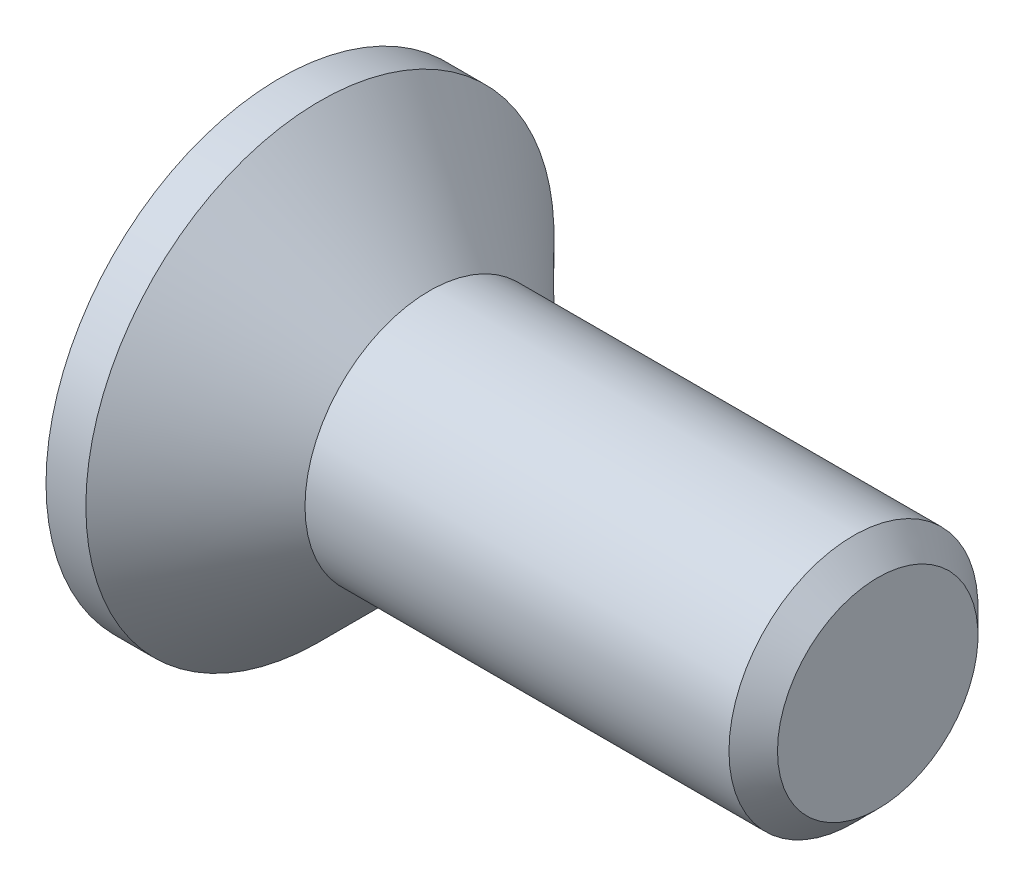
ISO-10303-21;
HEADER;
FILE_DESCRIPTION(('STEP AP214'),'2;1');
FILE_NAME('part.step','',(''),(''),'','','');
FILE_SCHEMA(('AUTOMOTIVE_DESIGN { 1 0 10303 214 1 1 1 1 }'));
ENDSEC;
DATA;
#1=APPLICATION_CONTEXT('core data for automotive mechanical design processes');
#2=APPLICATION_PROTOCOL_DEFINITION('international standard','automotive_design',2000,#1);
#3=PRODUCT_CONTEXT('',#1,'mechanical');
#4=PRODUCT('Part','Part','',(#3));
#5=PRODUCT_RELATED_PRODUCT_CATEGORY('part','',(#4));
#6=PRODUCT_DEFINITION_FORMATION('','',#4);
#7=PRODUCT_DEFINITION_CONTEXT('part definition',#1,'design');
#8=PRODUCT_DEFINITION('design','',#6,#7);
#9=PRODUCT_DEFINITION_SHAPE('','',#8);
#10=(LENGTH_UNIT() NAMED_UNIT(*) SI_UNIT(.MILLI.,.METRE.));
#11=(NAMED_UNIT(*) PLANE_ANGLE_UNIT() SI_UNIT($,.RADIAN.));
#12=(NAMED_UNIT(*) SI_UNIT($,.STERADIAN.) SOLID_ANGLE_UNIT());
#13=UNCERTAINTY_MEASURE_WITH_UNIT(LENGTH_MEASURE(1.E-05),#10,'distance_accuracy_value','');
#14=(GEOMETRIC_REPRESENTATION_CONTEXT(3) GLOBAL_UNCERTAINTY_ASSIGNED_CONTEXT((#13)) GLOBAL_UNIT_ASSIGNED_CONTEXT((#10,
#11,#12)) REPRESENTATION_CONTEXT('',''));
#15=CARTESIAN_POINT('',(0.,0.,0.));
#16=DIRECTION('',(0.,0.,1.));
#17=DIRECTION('',(1.,0.,0.));
#18=AXIS2_PLACEMENT_3D('',#15,#16,#17);
#19=CARTESIAN_POINT('',(0.,0.,0.));
#20=DIRECTION('',(-1.,0.,0.));
#21=DIRECTION('',(0.,0.,1.));
#22=AXIS2_PLACEMENT_3D('',#19,#20,#21);
#23=CYLINDRICAL_SURFACE('',#22,2.35);
#24=CARTESIAN_POINT('',(0.4,0.,0.));
#25=DIRECTION('',(-1.,0.,0.));
#26=DIRECTION('',(0.,0.,1.));
#27=AXIS2_PLACEMENT_3D('',#24,#25,#26);
#28=CIRCLE('',#27,2.35);
#29=CARTESIAN_POINT('',(0.4,0.,2.35));
#30=VERTEX_POINT('',#29);
#31=EDGE_CURVE('E219',#30,#30,#28,.T.);
#32=ORIENTED_EDGE('',*,*,#31,.T.);
#33=EDGE_LOOP('',(#32));
#34=FACE_BOUND('',#33,.T.);
#35=CARTESIAN_POINT('',(0.,0.,0.));
#36=DIRECTION('',(-1.,0.,0.));
#37=DIRECTION('',(0.,0.,1.));
#38=AXIS2_PLACEMENT_3D('',#35,#36,#37);
#39=CIRCLE('',#38,2.35);
#40=CARTESIAN_POINT('',(0.,0.,2.35));
#41=VERTEX_POINT('',#40);
#42=EDGE_CURVE('E11',#41,#41,#39,.T.);
#43=ORIENTED_EDGE('',*,*,#42,.F.);
#44=EDGE_LOOP('',(#43));
#45=FACE_BOUND('',#44,.T.);
#46=ADVANCED_FACE('F16',(#34,#45),#23,.T.);
#47=CARTESIAN_POINT('',(0.,0.,0.));
#48=DIRECTION('',(-1.,0.,0.));
#49=DIRECTION('',(0.,0.,1.));
#50=AXIS2_PLACEMENT_3D('',#47,#48,#49);
#51=PLANE('',#50);
#52=DIRECTION('',(0.,1.,0.));
#53=VECTOR('',#52,1.);
#54=CARTESIAN_POINT('',(0.,-0.29,1.45));
#55=LINE('',#54,#53);
#56=CARTESIAN_POINT('',(0.,-0.29,1.45));
#57=VERTEX_POINT('',#56);
#58=CARTESIAN_POINT('',(0.,0.29,1.45));
#59=VERTEX_POINT('',#58);
#60=EDGE_CURVE('E31',#57,#59,#55,.T.);
#61=ORIENTED_EDGE('',*,*,#60,.F.);
#62=DIRECTION('',(0.,0.,-1.));
#63=VECTOR('',#62,1.);
#64=CARTESIAN_POINT('',(0.,-0.29,1.45));
#65=LINE('',#64,#63);
#66=CARTESIAN_POINT('',(0.,-0.29,0.58));
#67=VERTEX_POINT('',#66);
#68=EDGE_CURVE('E206',#57,#67,#65,.T.);
#69=ORIENTED_EDGE('',*,*,#68,.T.);
#70=CARTESIAN_POINT('',(0.,-0.58,0.58));
#71=DIRECTION('',(1.,0.,0.));
#72=DIRECTION('',(0.,0.,-1.));
#73=AXIS2_PLACEMENT_3D('',#70,#71,#72);
#74=CIRCLE('',#73,0.29);
#75=CARTESIAN_POINT('',(0.,-0.58,0.29));
#76=VERTEX_POINT('',#75);
#77=EDGE_CURVE('E202',#76,#67,#74,.T.);
#78=ORIENTED_EDGE('',*,*,#77,.F.);
#79=DIRECTION('',(0.,1.,0.));
#80=VECTOR('',#79,1.);
#81=CARTESIAN_POINT('',(0.,-1.45,0.29));
#82=LINE('',#81,#80);
#83=CARTESIAN_POINT('',(0.,-1.45,0.29));
#84=VERTEX_POINT('',#83);
#85=EDGE_CURVE('E198',#84,#76,#82,.T.);
#86=ORIENTED_EDGE('',*,*,#85,.F.);
#87=DIRECTION('',(0.,0.,-1.));
#88=VECTOR('',#87,1.);
#89=CARTESIAN_POINT('',(0.,-1.45,0.29));
#90=LINE('',#89,#88);
#91=CARTESIAN_POINT('',(0.,-1.45,-0.29));
#92=VERTEX_POINT('',#91);
#93=EDGE_CURVE('E194',#84,#92,#90,.T.);
#94=ORIENTED_EDGE('',*,*,#93,.T.);
#95=DIRECTION('',(0.,1.,0.));
#96=VECTOR('',#95,1.);
#97=CARTESIAN_POINT('',(0.,-1.45,-0.29));
#98=LINE('',#97,#96);
#99=CARTESIAN_POINT('',(0.,-0.58,-0.29));
#100=VERTEX_POINT('',#99);
#101=EDGE_CURVE('E190',#92,#100,#98,.T.);
#102=ORIENTED_EDGE('',*,*,#101,.T.);
#103=CARTESIAN_POINT('',(0.,-0.58,-0.58));
#104=DIRECTION('',(1.,0.,0.));
#105=DIRECTION('',(0.,0.,-1.));
#106=AXIS2_PLACEMENT_3D('',#103,#104,#105);
#107=CIRCLE('',#106,0.29);
#108=CARTESIAN_POINT('',(0.,-0.29,-0.58));
#109=VERTEX_POINT('',#108);
#110=EDGE_CURVE('E186',#109,#100,#107,.T.);
#111=ORIENTED_EDGE('',*,*,#110,.F.);
#112=DIRECTION('',(0.,0.,-1.));
#113=VECTOR('',#112,1.);
#114=CARTESIAN_POINT('',(0.,-0.29,-0.58));
#115=LINE('',#114,#113);
#116=CARTESIAN_POINT('',(0.,-0.29,-1.45));
#117=VERTEX_POINT('',#116);
#118=EDGE_CURVE('E182',#109,#117,#115,.T.);
#119=ORIENTED_EDGE('',*,*,#118,.T.);
#120=DIRECTION('',(0.,1.,0.));
#121=VECTOR('',#120,1.);
#122=CARTESIAN_POINT('',(0.,-0.29,-1.45));
#123=LINE('',#122,#121);
#124=CARTESIAN_POINT('',(0.,0.29,-1.45));
#125=VERTEX_POINT('',#124);
#126=EDGE_CURVE('E178',#117,#125,#123,.T.);
#127=ORIENTED_EDGE('',*,*,#126,.T.);
#128=DIRECTION('',(0.,0.,-1.));
#129=VECTOR('',#128,1.);
#130=CARTESIAN_POINT('',(0.,0.29,-0.58));
#131=LINE('',#130,#129);
#132=CARTESIAN_POINT('',(0.,0.29,-0.58));
#133=VERTEX_POINT('',#132);
#134=EDGE_CURVE('E174',#133,#125,#131,.T.);
#135=ORIENTED_EDGE('',*,*,#134,.F.);
#136=CARTESIAN_POINT('',(0.,0.58,-0.58));
#137=DIRECTION('',(1.,0.,0.));
#138=DIRECTION('',(0.,0.,-1.));
#139=AXIS2_PLACEMENT_3D('',#136,#137,#138);
#140=CIRCLE('',#139,0.29);
#141=CARTESIAN_POINT('',(0.,0.58,-0.29));
#142=VERTEX_POINT('',#141);
#143=EDGE_CURVE('E170',#142,#133,#140,.T.);
#144=ORIENTED_EDGE('',*,*,#143,.F.);
#145=DIRECTION('',(0.,1.,0.));
#146=VECTOR('',#145,1.);
#147=CARTESIAN_POINT('',(0.,0.58,-0.29));
#148=LINE('',#147,#146);
#149=CARTESIAN_POINT('',(0.,1.45,-0.29));
#150=VERTEX_POINT('',#149);
#151=EDGE_CURVE('E166',#142,#150,#148,.T.);
#152=ORIENTED_EDGE('',*,*,#151,.T.);
#153=DIRECTION('',(0.,0.,-1.));
#154=VECTOR('',#153,1.);
#155=CARTESIAN_POINT('',(0.,1.45,0.29));
#156=LINE('',#155,#154);
#157=CARTESIAN_POINT('',(0.,1.45,0.29));
#158=VERTEX_POINT('',#157);
#159=EDGE_CURVE('E160',#158,#150,#156,.T.);
#160=ORIENTED_EDGE('',*,*,#159,.F.);
#161=DIRECTION('',(0.,1.,0.));
#162=VECTOR('',#161,1.);
#163=CARTESIAN_POINT('',(0.,0.58,0.29));
#164=LINE('',#163,#162);
#165=CARTESIAN_POINT('',(0.,0.58,0.29));
#166=VERTEX_POINT('',#165);
#167=EDGE_CURVE('E154',#166,#158,#164,.T.);
#168=ORIENTED_EDGE('',*,*,#167,.F.);
#169=CARTESIAN_POINT('',(0.,0.58,0.58));
#170=DIRECTION('',(1.,0.,0.));
#171=DIRECTION('',(0.,0.,-1.));
#172=AXIS2_PLACEMENT_3D('',#169,#170,#171);
#173=CIRCLE('',#172,0.29);
#174=CARTESIAN_POINT('',(0.,0.29,0.58));
#175=VERTEX_POINT('',#174);
#176=EDGE_CURVE('E133',#175,#166,#173,.T.);
#177=ORIENTED_EDGE('',*,*,#176,.F.);
#178=DIRECTION('',(0.,0.,-1.));
#179=VECTOR('',#178,1.);
#180=CARTESIAN_POINT('',(0.,0.29,1.45));
#181=LINE('',#180,#179);
#182=EDGE_CURVE('E145',#59,#175,#181,.T.);
#183=ORIENTED_EDGE('',*,*,#182,.F.);
#184=EDGE_LOOP('',(#61,#69,#78,#86,#94,#102,#111,#119,#127,#135,#144,#152,#160,#168,#177,#183));
#185=FACE_BOUND('',#184,.T.);
#186=ORIENTED_EDGE('',*,*,#42,.T.);
#187=EDGE_LOOP('',(#186));
#188=FACE_BOUND('',#187,.T.);
#189=ADVANCED_FACE('F150',(#185,#188),#51,.T.);
#190=CARTESIAN_POINT('',(6.,0.,0.));
#191=DIRECTION('',(-1.,0.,0.));
#192=DIRECTION('',(0.,0.,1.));
#193=AXIS2_PLACEMENT_3D('',#190,#191,#192);
#194=PLANE('',#193);
#195=CARTESIAN_POINT('',(6.,0.,0.));
#196=DIRECTION('',(-1.,0.,0.));
#197=DIRECTION('',(0.,0.,1.));
#198=AXIS2_PLACEMENT_3D('',#195,#196,#197);
#199=CIRCLE('',#198,1.0064375);
#200=CARTESIAN_POINT('',(6.,0.,1.0064375));
#201=VERTEX_POINT('',#200);
#202=EDGE_CURVE('E24',#201,#201,#199,.T.);
#203=ORIENTED_EDGE('',*,*,#202,.F.);
#204=EDGE_LOOP('',(#203));
#205=FACE_BOUND('',#204,.T.);
#206=ADVANCED_FACE('F330',(#205),#194,.F.);
#207=CARTESIAN_POINT('',(5.7564375,0.,0.));
#208=DIRECTION('',(-1.,0.,0.));
#209=DIRECTION('',(0.,0.,1.));
#210=AXIS2_PLACEMENT_3D('',#207,#208,#209);
#211=CONICAL_SURFACE('',#210,1.25,0.785398163397446);
#212=ORIENTED_EDGE('',*,*,#202,.T.);
#213=EDGE_LOOP('',(#212));
#214=FACE_BOUND('',#213,.T.);
#215=CARTESIAN_POINT('',(5.7564375,0.,0.));
#216=DIRECTION('',(-1.,0.,0.));
#217=DIRECTION('',(0.,0.,1.));
#218=AXIS2_PLACEMENT_3D('',#215,#216,#217);
#219=CIRCLE('',#218,1.25);
#220=CARTESIAN_POINT('',(5.7564375,0.,1.25));
#221=VERTEX_POINT('',#220);
#222=EDGE_CURVE('E317',#221,#221,#219,.T.);
#223=ORIENTED_EDGE('',*,*,#222,.F.);
#224=EDGE_LOOP('',(#223));
#225=FACE_BOUND('',#224,.T.);
#226=ADVANCED_FACE('F327',(#214,#225),#211,.T.);
#227=CARTESIAN_POINT('',(0.,0.,0.));
#228=DIRECTION('',(-1.,0.,0.));
#229=DIRECTION('',(0.,0.,1.));
#230=AXIS2_PLACEMENT_3D('',#227,#228,#229);
#231=CYLINDRICAL_SURFACE('',#230,1.25);
#232=ORIENTED_EDGE('',*,*,#222,.T.);
#233=EDGE_LOOP('',(#232));
#234=FACE_BOUND('',#233,.T.);
#235=CARTESIAN_POINT('',(1.5,0.,0.));
#236=DIRECTION('',(-1.,0.,0.));
#237=DIRECTION('',(0.,0.,1.));
#238=AXIS2_PLACEMENT_3D('',#235,#236,#237);
#239=CIRCLE('',#238,1.25);
#240=CARTESIAN_POINT('',(1.5,0.,1.25));
#241=VERTEX_POINT('',#240);
#242=EDGE_CURVE('E313',#241,#241,#239,.T.);
#243=ORIENTED_EDGE('',*,*,#242,.F.);
#244=EDGE_LOOP('',(#243));
#245=FACE_BOUND('',#244,.T.);
#246=ADVANCED_FACE('F338',(#234,#245),#231,.T.);
#247=CARTESIAN_POINT('',(1.5,0.,0.));
#248=DIRECTION('',(-1.,0.,0.));
#249=DIRECTION('',(0.,0.,1.));
#250=AXIS2_PLACEMENT_3D('',#247,#248,#249);
#251=CONICAL_SURFACE('',#250,1.25,0.785398163397448);
#252=ORIENTED_EDGE('',*,*,#31,.F.);
#253=EDGE_LOOP('',(#252));
#254=FACE_BOUND('',#253,.T.);
#255=ORIENTED_EDGE('',*,*,#242,.T.);
#256=EDGE_LOOP('',(#255));
#257=FACE_BOUND('',#256,.T.);
#258=ADVANCED_FACE('F348',(#254,#257),#251,.T.);
#259=CARTESIAN_POINT('',(0.,-0.29,1.45));
#260=DIRECTION('',(0.149438132473599,0.,0.988771077936042));
#261=DIRECTION('',(0.988771077936042,0.,-0.149438132473599));
#262=AXIS2_PLACEMENT_3D('',#259,#260,#261);
#263=PLANE('',#262);
#264=ORIENTED_EDGE('',*,*,#60,.T.);
#265=DIRECTION('',(-0.977912120929502,0.14779696163853,0.14779696163853));
#266=VECTOR('',#265,1.);
#267=CARTESIAN_POINT('',(0.0838288153292653,0.277330513715643,1.43733051371564));
#268=LINE('',#267,#266);
#269=CARTESIAN_POINT('',(1.4,0.0784106947183877,1.23841069471839));
#270=VERTEX_POINT('',#269);
#271=EDGE_CURVE('E142',#270,#59,#268,.T.);
#272=ORIENTED_EDGE('',*,*,#271,.F.);
#273=DIRECTION('',(0.,1.,0.));
#274=VECTOR('',#273,1.);
#275=CARTESIAN_POINT('',(1.4,-0.29,1.23841069471839));
#276=LINE('',#275,#274);
#277=CARTESIAN_POINT('',(1.4,-0.0784106947183861,1.23841069471839));
#278=VERTEX_POINT('',#277);
#279=EDGE_CURVE('E210',#278,#270,#276,.T.);
#280=ORIENTED_EDGE('',*,*,#279,.F.);
#281=DIRECTION('',(0.977912120929502,0.14779696163853,-0.14779696163853));
#282=VECTOR('',#281,1.);
#283=CARTESIAN_POINT('',(0.,-0.29,1.45));
#284=LINE('',#283,#282);
#285=EDGE_CURVE('E38',#278,#57,#284,.F.);
#286=ORIENTED_EDGE('',*,*,#285,.T.);
#287=EDGE_LOOP('',(#264,#272,#280,#286));
#288=FACE_BOUND('',#287,.T.);
#289=ADVANCED_FACE('F351',(#288),#263,.F.);
#290=CARTESIAN_POINT('',(0.,-0.29,1.45));
#291=DIRECTION('',(0.149438132473599,-0.988771077936042,0.));
#292=DIRECTION('',(-0.988771077936042,-0.149438132473599,0.));
#293=AXIS2_PLACEMENT_3D('',#290,#291,#292);
#294=PLANE('',#293);
#295=ORIENTED_EDGE('',*,*,#68,.F.);
#296=ORIENTED_EDGE('',*,*,#285,.F.);
#297=DIRECTION('',(0.,0.,1.));
#298=VECTOR('',#297,1.);
#299=CARTESIAN_POINT('',(1.4,-0.0784106947183862,1.45));
#300=LINE('',#299,#298);
#301=CARTESIAN_POINT('',(1.4,-0.0784106947183868,0.58));
#302=VERTEX_POINT('',#301);
#303=EDGE_CURVE('E256',#278,#302,#300,.F.);
#304=ORIENTED_EDGE('',*,*,#303,.T.);
#305=DIRECTION('',(-0.988771077936042,-0.149438132473599,0.));
#306=VECTOR('',#305,1.);
#307=CARTESIAN_POINT('',(0.,-0.29,0.58));
#308=LINE('',#307,#306);
#309=EDGE_CURVE('E213',#302,#67,#308,.T.);
#310=ORIENTED_EDGE('',*,*,#309,.T.);
#311=EDGE_LOOP('',(#295,#296,#304,#310));
#312=FACE_BOUND('',#311,.T.);
#313=ADVANCED_FACE('F363',(#312),#294,.F.);
#314=CARTESIAN_POINT('',(0.,-0.58,0.58));
#315=DIRECTION('',(1.,0.,0.));
#316=DIRECTION('',(0.,0.,-1.));
#317=AXIS2_PLACEMENT_3D('',#314,#315,#316);
#318=CONICAL_SURFACE('',#317,0.29,0.15);
#319=ORIENTED_EDGE('',*,*,#77,.T.);
#320=ORIENTED_EDGE('',*,*,#309,.F.);
#321=CARTESIAN_POINT('',(1.4,-0.58,0.58));
#322=DIRECTION('',(1.,0.,0.));
#323=DIRECTION('',(0.,0.,-1.));
#324=AXIS2_PLACEMENT_3D('',#321,#322,#323);
#325=CIRCLE('',#324,0.501589305281613);
#326=CARTESIAN_POINT('',(1.4,-0.58,0.0784106947183868));
#327=VERTEX_POINT('',#326);
#328=EDGE_CURVE('E259',#327,#302,#325,.T.);
#329=ORIENTED_EDGE('',*,*,#328,.F.);
#330=DIRECTION('',(-0.988771077936042,0.,0.149438132473599));
#331=VECTOR('',#330,1.);
#332=CARTESIAN_POINT('',(0.,-0.58,0.29));
#333=LINE('',#332,#331);
#334=EDGE_CURVE('E216',#327,#76,#333,.T.);
#335=ORIENTED_EDGE('',*,*,#334,.T.);
#336=EDGE_LOOP('',(#319,#320,#329,#335));
#337=FACE_BOUND('',#336,.T.);
#338=ADVANCED_FACE('F412',(#337),#318,.T.);
#339=CARTESIAN_POINT('',(0.,-1.45,0.29));
#340=DIRECTION('',(0.149438132473599,0.,0.988771077936042));
#341=DIRECTION('',(0.988771077936042,0.,-0.149438132473599));
#342=AXIS2_PLACEMENT_3D('',#339,#340,#341);
#343=PLANE('',#342);
#344=ORIENTED_EDGE('',*,*,#85,.T.);
#345=ORIENTED_EDGE('',*,*,#334,.F.);
#346=DIRECTION('',(0.,1.,0.));
#347=VECTOR('',#346,1.);
#348=CARTESIAN_POINT('',(1.4,-1.45,0.0784106947183868));
#349=LINE('',#348,#347);
#350=CARTESIAN_POINT('',(1.4,-1.23841069471839,0.0784106947183868));
#351=VERTEX_POINT('',#350);
#352=EDGE_CURVE('E263',#351,#327,#349,.T.);
#353=ORIENTED_EDGE('',*,*,#352,.F.);
#354=DIRECTION('',(0.977912120929502,0.14779696163853,-0.14779696163853));
#355=VECTOR('',#354,1.);
#356=CARTESIAN_POINT('',(0.,-1.45,0.29));
#357=LINE('',#356,#355);
#358=EDGE_CURVE('E222',#351,#84,#357,.F.);
#359=ORIENTED_EDGE('',*,*,#358,.T.);
#360=EDGE_LOOP('',(#344,#345,#353,#359));
#361=FACE_BOUND('',#360,.T.);
#362=ADVANCED_FACE('F408',(#361),#343,.F.);
#363=CARTESIAN_POINT('',(0.,-1.45,0.29));
#364=DIRECTION('',(0.149438132473599,-0.988771077936042,0.));
#365=DIRECTION('',(-0.988771077936042,-0.149438132473599,0.));
#366=AXIS2_PLACEMENT_3D('',#363,#364,#365);
#367=PLANE('',#366);
#368=ORIENTED_EDGE('',*,*,#93,.F.);
#369=ORIENTED_EDGE('',*,*,#358,.F.);
#370=DIRECTION('',(0.,0.,1.));
#371=VECTOR('',#370,1.);
#372=CARTESIAN_POINT('',(1.4,-1.23841069471839,0.29));
#373=LINE('',#372,#371);
#374=CARTESIAN_POINT('',(1.4,-1.23841069471839,-0.078410694718387));
#375=VERTEX_POINT('',#374);
#376=EDGE_CURVE('E267',#351,#375,#373,.F.);
#377=ORIENTED_EDGE('',*,*,#376,.T.);
#378=DIRECTION('',(-0.977912120929502,-0.14779696163853,-0.14779696163853));
#379=VECTOR('',#378,1.);
#380=CARTESIAN_POINT('',(0.,-1.45,-0.29));
#381=LINE('',#380,#379);
#382=EDGE_CURVE('E225',#375,#92,#381,.T.);
#383=ORIENTED_EDGE('',*,*,#382,.T.);
#384=EDGE_LOOP('',(#368,#369,#377,#383));
#385=FACE_BOUND('',#384,.T.);
#386=ADVANCED_FACE('F404',(#385),#367,.F.);
#387=CARTESIAN_POINT('',(0.,-1.45,-0.29));
#388=DIRECTION('',(0.149438132473599,0.,-0.988771077936042));
#389=DIRECTION('',(-0.988771077936042,0.,-0.149438132473599));
#390=AXIS2_PLACEMENT_3D('',#387,#388,#389);
#391=PLANE('',#390);
#392=ORIENTED_EDGE('',*,*,#101,.F.);
#393=ORIENTED_EDGE('',*,*,#382,.F.);
#394=DIRECTION('',(0.,-1.,0.));
#395=VECTOR('',#394,1.);
#396=CARTESIAN_POINT('',(1.4,-1.45,-0.0784106947183871));
#397=LINE('',#396,#395);
#398=CARTESIAN_POINT('',(1.4,-0.58,-0.0784106947183872));
#399=VERTEX_POINT('',#398);
#400=EDGE_CURVE('E270',#375,#399,#397,.F.);
#401=ORIENTED_EDGE('',*,*,#400,.T.);
#402=DIRECTION('',(-0.988771077936042,0.,-0.149438132473599));
#403=VECTOR('',#402,1.);
#404=CARTESIAN_POINT('',(0.,-0.58,-0.29));
#405=LINE('',#404,#403);
#406=EDGE_CURVE('E228',#399,#100,#405,.T.);
#407=ORIENTED_EDGE('',*,*,#406,.T.);
#408=EDGE_LOOP('',(#392,#393,#401,#407));
#409=FACE_BOUND('',#408,.T.);
#410=ADVANCED_FACE('F400',(#409),#391,.F.);
#411=CARTESIAN_POINT('',(0.,-0.58,-0.58));
#412=DIRECTION('',(1.,0.,0.));
#413=DIRECTION('',(0.,0.,-1.));
#414=AXIS2_PLACEMENT_3D('',#411,#412,#413);
#415=CONICAL_SURFACE('',#414,0.29,0.15);
#416=ORIENTED_EDGE('',*,*,#110,.T.);
#417=ORIENTED_EDGE('',*,*,#406,.F.);
#418=CARTESIAN_POINT('',(1.4,-0.58,-0.58));
#419=DIRECTION('',(1.,0.,0.));
#420=DIRECTION('',(0.,0.,-1.));
#421=AXIS2_PLACEMENT_3D('',#418,#419,#420);
#422=CIRCLE('',#421,0.501589305281613);
#423=CARTESIAN_POINT('',(1.4,-0.0784106947183868,-0.58));
#424=VERTEX_POINT('',#423);
#425=EDGE_CURVE('E273',#424,#399,#422,.T.);
#426=ORIENTED_EDGE('',*,*,#425,.F.);
#427=DIRECTION('',(-0.988771077936042,-0.149438132473599,0.));
#428=VECTOR('',#427,1.);
#429=CARTESIAN_POINT('',(0.,-0.29,-0.58));
#430=LINE('',#429,#428);
#431=EDGE_CURVE('E231',#424,#109,#430,.T.);
#432=ORIENTED_EDGE('',*,*,#431,.T.);
#433=EDGE_LOOP('',(#416,#417,#426,#432));
#434=FACE_BOUND('',#433,.T.);
#435=ADVANCED_FACE('F396',(#434),#415,.T.);
#436=CARTESIAN_POINT('',(0.,-0.29,-0.58));
#437=DIRECTION('',(0.149438132473599,-0.988771077936042,0.));
#438=DIRECTION('',(-0.988771077936042,-0.149438132473599,0.));
#439=AXIS2_PLACEMENT_3D('',#436,#437,#438);
#440=PLANE('',#439);
#441=ORIENTED_EDGE('',*,*,#118,.F.);
#442=ORIENTED_EDGE('',*,*,#431,.F.);
#443=DIRECTION('',(0.,0.,1.));
#444=VECTOR('',#443,1.);
#445=CARTESIAN_POINT('',(1.4,-0.0784106947183867,-0.58));
#446=LINE('',#445,#444);
#447=CARTESIAN_POINT('',(1.4,-0.0784106947183867,-1.23841069471839));
#448=VERTEX_POINT('',#447);
#449=EDGE_CURVE('E277',#424,#448,#446,.F.);
#450=ORIENTED_EDGE('',*,*,#449,.T.);
#451=DIRECTION('',(-0.977912120929502,-0.14779696163853,-0.14779696163853));
#452=VECTOR('',#451,1.);
#453=CARTESIAN_POINT('',(0.,-0.29,-1.45));
#454=LINE('',#453,#452);
#455=EDGE_CURVE('E234',#448,#117,#454,.T.);
#456=ORIENTED_EDGE('',*,*,#455,.T.);
#457=EDGE_LOOP('',(#441,#442,#450,#456));
#458=FACE_BOUND('',#457,.T.);
#459=ADVANCED_FACE('F392',(#458),#440,.F.);
#460=CARTESIAN_POINT('',(0.,-0.29,-1.45));
#461=DIRECTION('',(0.149438132473599,0.,-0.988771077936042));
#462=DIRECTION('',(-0.988771077936042,0.,-0.149438132473599));
#463=AXIS2_PLACEMENT_3D('',#460,#461,#462);
#464=PLANE('',#463);
#465=ORIENTED_EDGE('',*,*,#126,.F.);
#466=ORIENTED_EDGE('',*,*,#455,.F.);
#467=DIRECTION('',(0.,-1.,0.));
#468=VECTOR('',#467,1.);
#469=CARTESIAN_POINT('',(1.4,-0.29,-1.23841069471839));
#470=LINE('',#469,#468);
#471=CARTESIAN_POINT('',(1.4,0.0784106947183871,-1.23841069471839));
#472=VERTEX_POINT('',#471);
#473=EDGE_CURVE('E280',#448,#472,#470,.F.);
#474=ORIENTED_EDGE('',*,*,#473,.T.);
#475=DIRECTION('',(0.977912120929502,-0.14779696163853,0.14779696163853));
#476=VECTOR('',#475,1.);
#477=CARTESIAN_POINT('',(0.0838288153292655,0.277330513715643,-1.43733051371564));
#478=LINE('',#477,#476);
#479=EDGE_CURVE('E237',#472,#125,#478,.F.);
#480=ORIENTED_EDGE('',*,*,#479,.T.);
#481=EDGE_LOOP('',(#465,#466,#474,#480));
#482=FACE_BOUND('',#481,.T.);
#483=ADVANCED_FACE('F388',(#482),#464,.F.);
#484=CARTESIAN_POINT('',(0.,0.29,-0.58));
#485=DIRECTION('',(0.149438132473599,0.988771077936042,0.));
#486=DIRECTION('',(0.988771077936042,-0.149438132473599,0.));
#487=AXIS2_PLACEMENT_3D('',#484,#485,#486);
#488=PLANE('',#487);
#489=ORIENTED_EDGE('',*,*,#134,.T.);
#490=ORIENTED_EDGE('',*,*,#479,.F.);
#491=DIRECTION('',(0.,0.,-1.));
#492=VECTOR('',#491,1.);
#493=CARTESIAN_POINT('',(1.4,0.0784106947183872,-0.58));
#494=LINE('',#493,#492);
#495=CARTESIAN_POINT('',(1.4,0.0784106947183872,-0.58));
#496=VERTEX_POINT('',#495);
#497=EDGE_CURVE('E283',#496,#472,#494,.T.);
#498=ORIENTED_EDGE('',*,*,#497,.F.);
#499=DIRECTION('',(-0.988771077936042,0.149438132473599,0.));
#500=VECTOR('',#499,1.);
#501=CARTESIAN_POINT('',(0.,0.29,-0.58));
#502=LINE('',#501,#500);
#503=EDGE_CURVE('E240',#496,#133,#502,.T.);
#504=ORIENTED_EDGE('',*,*,#503,.T.);
#505=EDGE_LOOP('',(#489,#490,#498,#504));
#506=FACE_BOUND('',#505,.T.);
#507=ADVANCED_FACE('F384',(#506),#488,.F.);
#508=CARTESIAN_POINT('',(0.,0.58,-0.58));
#509=DIRECTION('',(1.,0.,0.));
#510=DIRECTION('',(0.,0.,-1.));
#511=AXIS2_PLACEMENT_3D('',#508,#509,#510);
#512=CONICAL_SURFACE('',#511,0.29,0.15);
#513=ORIENTED_EDGE('',*,*,#143,.T.);
#514=ORIENTED_EDGE('',*,*,#503,.F.);
#515=CARTESIAN_POINT('',(1.4,0.58,-0.58));
#516=DIRECTION('',(1.,0.,0.));
#517=DIRECTION('',(0.,0.,-1.));
#518=AXIS2_PLACEMENT_3D('',#515,#516,#517);
#519=CIRCLE('',#518,0.501589305281613);
#520=CARTESIAN_POINT('',(1.4,0.58,-0.0784106947183867));
#521=VERTEX_POINT('',#520);
#522=EDGE_CURVE('E287',#521,#496,#519,.T.);
#523=ORIENTED_EDGE('',*,*,#522,.F.);
#524=DIRECTION('',(-0.988771077936042,0.,-0.149438132473599));
#525=VECTOR('',#524,1.);
#526=CARTESIAN_POINT('',(0.,0.58,-0.29));
#527=LINE('',#526,#525);
#528=EDGE_CURVE('E243',#521,#142,#527,.T.);
#529=ORIENTED_EDGE('',*,*,#528,.T.);
#530=EDGE_LOOP('',(#513,#514,#523,#529));
#531=FACE_BOUND('',#530,.T.);
#532=ADVANCED_FACE('F380',(#531),#512,.T.);
#533=CARTESIAN_POINT('',(0.,0.58,-0.29));
#534=DIRECTION('',(0.149438132473599,0.,-0.988771077936042));
#535=DIRECTION('',(-0.988771077936042,0.,-0.149438132473599));
#536=AXIS2_PLACEMENT_3D('',#533,#534,#535);
#537=PLANE('',#536);
#538=ORIENTED_EDGE('',*,*,#151,.F.);
#539=ORIENTED_EDGE('',*,*,#528,.F.);
#540=DIRECTION('',(0.,-1.,0.));
#541=VECTOR('',#540,1.);
#542=CARTESIAN_POINT('',(1.4,0.58,-0.0784106947183867));
#543=LINE('',#542,#541);
#544=CARTESIAN_POINT('',(1.4,1.23841069471839,-0.0784106947183867));
#545=VERTEX_POINT('',#544);
#546=EDGE_CURVE('E291',#521,#545,#543,.F.);
#547=ORIENTED_EDGE('',*,*,#546,.T.);
#548=DIRECTION('',(0.977912120929502,-0.14779696163853,0.14779696163853));
#549=VECTOR('',#548,1.);
#550=CARTESIAN_POINT('',(0.125743222993898,1.43099577057346,-0.270995770573465));
#551=LINE('',#550,#549);
#552=EDGE_CURVE('E246',#545,#150,#551,.F.);
#553=ORIENTED_EDGE('',*,*,#552,.T.);
#554=EDGE_LOOP('',(#538,#539,#547,#553));
#555=FACE_BOUND('',#554,.T.);
#556=ADVANCED_FACE('F376',(#555),#537,.F.);
#557=CARTESIAN_POINT('',(0.,1.45,0.29));
#558=DIRECTION('',(0.149438132473599,0.988771077936042,0.));
#559=DIRECTION('',(0.988771077936042,-0.149438132473599,0.));
#560=AXIS2_PLACEMENT_3D('',#557,#558,#559);
#561=PLANE('',#560);
#562=ORIENTED_EDGE('',*,*,#159,.T.);
#563=ORIENTED_EDGE('',*,*,#552,.F.);
#564=DIRECTION('',(0.,0.,-1.));
#565=VECTOR('',#564,1.);
#566=CARTESIAN_POINT('',(1.4,1.23841069471839,0.29));
#567=LINE('',#566,#565);
#568=CARTESIAN_POINT('',(1.4,1.23841069471839,0.0784106947183871));
#569=VERTEX_POINT('',#568);
#570=EDGE_CURVE('E294',#569,#545,#567,.T.);
#571=ORIENTED_EDGE('',*,*,#570,.F.);
#572=DIRECTION('',(-0.977912120929502,0.14779696163853,0.14779696163853));
#573=VECTOR('',#572,1.);
#574=CARTESIAN_POINT('',(0.125743222993898,1.43099577057346,0.270995770573465));
#575=LINE('',#574,#573);
#576=EDGE_CURVE('E249',#569,#158,#575,.T.);
#577=ORIENTED_EDGE('',*,*,#576,.T.);
#578=EDGE_LOOP('',(#562,#563,#571,#577));
#579=FACE_BOUND('',#578,.T.);
#580=ADVANCED_FACE('F372',(#579),#561,.F.);
#581=CARTESIAN_POINT('',(0.,0.58,0.29));
#582=DIRECTION('',(0.149438132473599,0.,0.988771077936042));
#583=DIRECTION('',(0.988771077936042,0.,-0.149438132473599));
#584=AXIS2_PLACEMENT_3D('',#581,#582,#583);
#585=PLANE('',#584);
#586=ORIENTED_EDGE('',*,*,#167,.T.);
#587=ORIENTED_EDGE('',*,*,#576,.F.);
#588=DIRECTION('',(0.,1.,0.));
#589=VECTOR('',#588,1.);
#590=CARTESIAN_POINT('',(1.4,0.58,0.0784106947183872));
#591=LINE('',#590,#589);
#592=CARTESIAN_POINT('',(1.4,0.58,0.078410694718387));
#593=VERTEX_POINT('',#592);
#594=EDGE_CURVE('E298',#593,#569,#591,.T.);
#595=ORIENTED_EDGE('',*,*,#594,.F.);
#596=DIRECTION('',(-0.988771077936042,0.,0.149438132473599));
#597=VECTOR('',#596,1.);
#598=CARTESIAN_POINT('',(0.,0.58,0.29));
#599=LINE('',#598,#597);
#600=EDGE_CURVE('E141',#593,#166,#599,.T.);
#601=ORIENTED_EDGE('',*,*,#600,.T.);
#602=EDGE_LOOP('',(#586,#587,#595,#601));
#603=FACE_BOUND('',#602,.T.);
#604=ADVANCED_FACE('F369',(#603),#585,.F.);
#605=CARTESIAN_POINT('',(0.,0.58,0.58));
#606=DIRECTION('',(1.,0.,0.));
#607=DIRECTION('',(0.,0.,-1.));
#608=AXIS2_PLACEMENT_3D('',#605,#606,#607);
#609=CONICAL_SURFACE('',#608,0.29,0.15);
#610=ORIENTED_EDGE('',*,*,#176,.T.);
#611=ORIENTED_EDGE('',*,*,#600,.F.);
#612=CARTESIAN_POINT('',(1.4,0.58,0.58));
#613=DIRECTION('',(1.,0.,0.));
#614=DIRECTION('',(0.,0.,-1.));
#615=AXIS2_PLACEMENT_3D('',#612,#613,#614);
#616=CIRCLE('',#615,0.501589305281613);
#617=CARTESIAN_POINT('',(1.4,0.0784106947183878,0.58));
#618=VERTEX_POINT('',#617);
#619=EDGE_CURVE('E136',#618,#593,#616,.T.);
#620=ORIENTED_EDGE('',*,*,#619,.F.);
#621=DIRECTION('',(-0.988771077936042,0.149438132473599,0.));
#622=VECTOR('',#621,1.);
#623=CARTESIAN_POINT('',(0.,0.29,0.58));
#624=LINE('',#623,#622);
#625=EDGE_CURVE('E129',#618,#175,#624,.T.);
#626=ORIENTED_EDGE('',*,*,#625,.T.);
#627=EDGE_LOOP('',(#610,#611,#620,#626));
#628=FACE_BOUND('',#627,.T.);
#629=ADVANCED_FACE('F131',(#628),#609,.T.);
#630=CARTESIAN_POINT('',(0.,0.29,1.45));
#631=DIRECTION('',(0.149438132473599,0.988771077936042,0.));
#632=DIRECTION('',(0.988771077936042,-0.149438132473599,0.));
#633=AXIS2_PLACEMENT_3D('',#630,#631,#632);
#634=PLANE('',#633);
#635=ORIENTED_EDGE('',*,*,#182,.T.);
#636=ORIENTED_EDGE('',*,*,#625,.F.);
#637=DIRECTION('',(0.,0.,-1.));
#638=VECTOR('',#637,1.);
#639=CARTESIAN_POINT('',(1.4,0.0784106947183877,1.45));
#640=LINE('',#639,#638);
#641=EDGE_CURVE('E304',#270,#618,#640,.T.);
#642=ORIENTED_EDGE('',*,*,#641,.F.);
#643=ORIENTED_EDGE('',*,*,#271,.T.);
#644=EDGE_LOOP('',(#635,#636,#642,#643));
#645=FACE_BOUND('',#644,.T.);
#646=ADVANCED_FACE('F146',(#645),#634,.F.);
#647=CARTESIAN_POINT('',(1.4,0.58,0.58));
#648=DIRECTION('',(1.,0.,0.));
#649=DIRECTION('',(0.,0.,-1.));
#650=AXIS2_PLACEMENT_3D('',#647,#648,#649);
#651=PLANE('',#650);
#652=ORIENTED_EDGE('',*,*,#279,.T.);
#653=ORIENTED_EDGE('',*,*,#641,.T.);
#654=ORIENTED_EDGE('',*,*,#619,.T.);
#655=ORIENTED_EDGE('',*,*,#594,.T.);
#656=ORIENTED_EDGE('',*,*,#570,.T.);
#657=ORIENTED_EDGE('',*,*,#546,.F.);
#658=ORIENTED_EDGE('',*,*,#522,.T.);
#659=ORIENTED_EDGE('',*,*,#497,.T.);
#660=ORIENTED_EDGE('',*,*,#473,.F.);
#661=ORIENTED_EDGE('',*,*,#449,.F.);
#662=ORIENTED_EDGE('',*,*,#425,.T.);
#663=ORIENTED_EDGE('',*,*,#400,.F.);
#664=ORIENTED_EDGE('',*,*,#376,.F.);
#665=ORIENTED_EDGE('',*,*,#352,.T.);
#666=ORIENTED_EDGE('',*,*,#328,.T.);
#667=ORIENTED_EDGE('',*,*,#303,.F.);
#668=EDGE_LOOP('',(#652,#653,#654,#655,#656,#657,#658,#659,#660,#661,#662,#663,#664,#665,#666,#667));
#669=FACE_BOUND('',#668,.T.);
#670=ADVANCED_FACE('F366',(#669),#651,.F.);
#671=CLOSED_SHELL('',(#46,#189,#206,#226,#246,#258,#289,#313,#338,#362,#386,#410,#435,#459,#483,
#507,#532,#556,#580,#604,#629,#646,#670));
#672=MANIFOLD_SOLID_BREP('B1',#671);
#673=ADVANCED_BREP_SHAPE_REPRESENTATION('',(#18,#672),#14);
#674=SHAPE_DEFINITION_REPRESENTATION(#9,#673);
ENDSEC;
END-ISO-10303-21;
